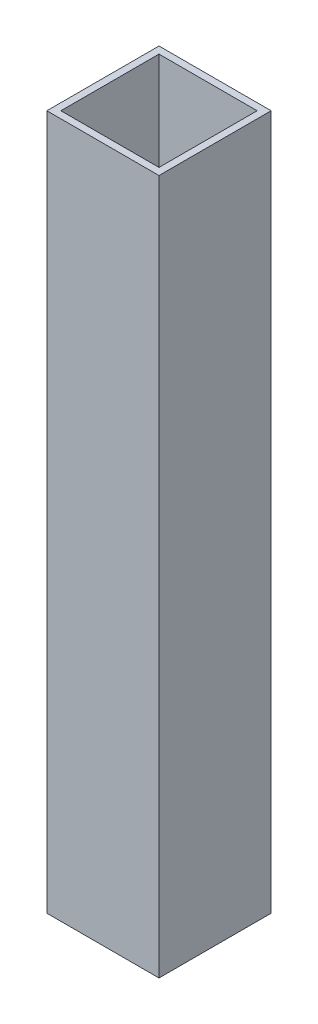
ISO-10303-21;
HEADER;
FILE_DESCRIPTION(('STEP AP214'),'2;1');
FILE_NAME('part.step','',(''),(''),'','','');
FILE_SCHEMA(('AUTOMOTIVE_DESIGN { 1 0 10303 214 1 1 1 1 }'));
ENDSEC;
DATA;
#1=APPLICATION_CONTEXT('core data for automotive mechanical design processes');
#2=APPLICATION_PROTOCOL_DEFINITION('international standard','automotive_design',2000,#1);
#3=PRODUCT_CONTEXT('',#1,'mechanical');
#4=PRODUCT('Part','Part','',(#3));
#5=PRODUCT_RELATED_PRODUCT_CATEGORY('part','',(#4));
#6=PRODUCT_DEFINITION_FORMATION('','',#4);
#7=PRODUCT_DEFINITION_CONTEXT('part definition',#1,'design');
#8=PRODUCT_DEFINITION('design','',#6,#7);
#9=PRODUCT_DEFINITION_SHAPE('','',#8);
#10=(LENGTH_UNIT() NAMED_UNIT(*) SI_UNIT(.MILLI.,.METRE.));
#11=(NAMED_UNIT(*) PLANE_ANGLE_UNIT() SI_UNIT($,.RADIAN.));
#12=(NAMED_UNIT(*) SI_UNIT($,.STERADIAN.) SOLID_ANGLE_UNIT());
#13=UNCERTAINTY_MEASURE_WITH_UNIT(LENGTH_MEASURE(1.E-05),#10,'distance_accuracy_value','');
#14=(GEOMETRIC_REPRESENTATION_CONTEXT(3) GLOBAL_UNCERTAINTY_ASSIGNED_CONTEXT((#13)) GLOBAL_UNIT_ASSIGNED_CONTEXT((#10,
#11,#12)) REPRESENTATION_CONTEXT('',''));
#15=CARTESIAN_POINT('',(0.,0.,0.));
#16=DIRECTION('',(0.,0.,1.));
#17=DIRECTION('',(1.,0.,0.));
#18=AXIS2_PLACEMENT_3D('',#15,#16,#17);
#19=CARTESIAN_POINT('',(0.,314.8076,0.));
#20=DIRECTION('',(0.,-1.,0.));
#21=DIRECTION('',(0.,0.,-1.));
#22=AXIS2_PLACEMENT_3D('',#19,#20,#21);
#23=PLANE('',#22);
#24=DIRECTION('',(0.,0.,-1.));
#25=VECTOR('',#24,1.);
#26=CARTESIAN_POINT('',(25.4,314.8076,25.4));
#27=LINE('',#26,#25);
#28=CARTESIAN_POINT('',(25.4,314.8076,25.4));
#29=VERTEX_POINT('',#28);
#30=CARTESIAN_POINT('',(25.4,314.8076,-25.4));
#31=VERTEX_POINT('',#30);
#32=EDGE_CURVE('E139',#29,#31,#27,.T.);
#33=ORIENTED_EDGE('',*,*,#32,.T.);
#34=DIRECTION('',(-1.,0.,0.));
#35=VECTOR('',#34,1.);
#36=CARTESIAN_POINT('',(-25.4,314.8076,-25.4));
#37=LINE('',#36,#35);
#38=CARTESIAN_POINT('',(-25.4,314.8076,-25.4));
#39=VERTEX_POINT('',#38);
#40=EDGE_CURVE('E142',#31,#39,#37,.T.);
#41=ORIENTED_EDGE('',*,*,#40,.T.);
#42=DIRECTION('',(0.,0.,1.));
#43=VECTOR('',#42,1.);
#44=CARTESIAN_POINT('',(-25.4,314.8076,25.4));
#45=LINE('',#44,#43);
#46=CARTESIAN_POINT('',(-25.4,314.8076,25.4));
#47=VERTEX_POINT('',#46);
#48=EDGE_CURVE('E147',#39,#47,#45,.T.);
#49=ORIENTED_EDGE('',*,*,#48,.T.);
#50=DIRECTION('',(1.,0.,0.));
#51=VECTOR('',#50,1.);
#52=CARTESIAN_POINT('',(-25.4,314.8076,25.4));
#53=LINE('',#52,#51);
#54=EDGE_CURVE('E149',#47,#29,#53,.T.);
#55=ORIENTED_EDGE('',*,*,#54,.T.);
#56=EDGE_LOOP('',(#33,#41,#49,#55));
#57=FACE_BOUND('',#56,.T.);
#58=DIRECTION('',(0.,0.,1.));
#59=VECTOR('',#58,1.);
#60=CARTESIAN_POINT('',(-22.225,314.8076,22.225));
#61=LINE('',#60,#59);
#62=CARTESIAN_POINT('',(-22.225,314.8076,-22.225));
#63=VERTEX_POINT('',#62);
#64=CARTESIAN_POINT('',(-22.225,314.8076,22.225));
#65=VERTEX_POINT('',#64);
#66=EDGE_CURVE('E101',#63,#65,#61,.T.);
#67=ORIENTED_EDGE('',*,*,#66,.F.);
#68=DIRECTION('',(-1.,0.,0.));
#69=VECTOR('',#68,1.);
#70=CARTESIAN_POINT('',(-22.225,314.8076,-22.225));
#71=LINE('',#70,#69);
#72=CARTESIAN_POINT('',(22.225,314.8076,-22.225));
#73=VERTEX_POINT('',#72);
#74=EDGE_CURVE('E128',#73,#63,#71,.T.);
#75=ORIENTED_EDGE('',*,*,#74,.F.);
#76=DIRECTION('',(0.,0.,-1.));
#77=VECTOR('',#76,1.);
#78=CARTESIAN_POINT('',(22.225,314.8076,22.225));
#79=LINE('',#78,#77);
#80=CARTESIAN_POINT('',(22.225,314.8076,22.225));
#81=VERTEX_POINT('',#80);
#82=EDGE_CURVE('E125',#81,#73,#79,.T.);
#83=ORIENTED_EDGE('',*,*,#82,.F.);
#84=DIRECTION('',(1.,0.,0.));
#85=VECTOR('',#84,1.);
#86=CARTESIAN_POINT('',(-22.225,314.8076,22.225));
#87=LINE('',#86,#85);
#88=EDGE_CURVE('E115',#65,#81,#87,.T.);
#89=ORIENTED_EDGE('',*,*,#88,.F.);
#90=EDGE_LOOP('',(#67,#75,#83,#89));
#91=FACE_BOUND('',#90,.T.);
#92=ADVANCED_FACE('F39',(#57,#91),#23,.F.);
#93=CARTESIAN_POINT('',(0.,0.,0.));
#94=DIRECTION('',(0.,-1.,0.));
#95=DIRECTION('',(0.,0.,-1.));
#96=AXIS2_PLACEMENT_3D('',#93,#94,#95);
#97=PLANE('',#96);
#98=DIRECTION('',(0.,0.,-1.));
#99=VECTOR('',#98,1.);
#100=CARTESIAN_POINT('',(25.4,0.,25.4));
#101=LINE('',#100,#99);
#102=CARTESIAN_POINT('',(25.4,0.,25.4));
#103=VERTEX_POINT('',#102);
#104=CARTESIAN_POINT('',(25.4,0.,-25.4));
#105=VERTEX_POINT('',#104);
#106=EDGE_CURVE('E120',#103,#105,#101,.T.);
#107=ORIENTED_EDGE('',*,*,#106,.F.);
#108=DIRECTION('',(1.,0.,0.));
#109=VECTOR('',#108,1.);
#110=CARTESIAN_POINT('',(-25.4,0.,25.4));
#111=LINE('',#110,#109);
#112=CARTESIAN_POINT('',(-25.4,0.,25.4));
#113=VERTEX_POINT('',#112);
#114=EDGE_CURVE('E143',#113,#103,#111,.T.);
#115=ORIENTED_EDGE('',*,*,#114,.F.);
#116=DIRECTION('',(0.,0.,1.));
#117=VECTOR('',#116,1.);
#118=CARTESIAN_POINT('',(-25.4,0.,25.4));
#119=LINE('',#118,#117);
#120=CARTESIAN_POINT('',(-25.4,0.,-25.4));
#121=VERTEX_POINT('',#120);
#122=EDGE_CURVE('E155',#121,#113,#119,.T.);
#123=ORIENTED_EDGE('',*,*,#122,.F.);
#124=DIRECTION('',(-1.,0.,0.));
#125=VECTOR('',#124,1.);
#126=CARTESIAN_POINT('',(-25.4,0.,-25.4));
#127=LINE('',#126,#125);
#128=EDGE_CURVE('E154',#105,#121,#127,.T.);
#129=ORIENTED_EDGE('',*,*,#128,.F.);
#130=EDGE_LOOP('',(#107,#115,#123,#129));
#131=FACE_BOUND('',#130,.T.);
#132=DIRECTION('',(-1.,0.,0.));
#133=VECTOR('',#132,1.);
#134=CARTESIAN_POINT('',(-22.225,0.,-22.225));
#135=LINE('',#134,#133);
#136=CARTESIAN_POINT('',(22.225,0.,-22.225));
#137=VERTEX_POINT('',#136);
#138=CARTESIAN_POINT('',(-22.225,0.,-22.225));
#139=VERTEX_POINT('',#138);
#140=EDGE_CURVE('E111',#137,#139,#135,.T.);
#141=ORIENTED_EDGE('',*,*,#140,.T.);
#142=DIRECTION('',(0.,0.,1.));
#143=VECTOR('',#142,1.);
#144=CARTESIAN_POINT('',(-22.225,0.,22.225));
#145=LINE('',#144,#143);
#146=CARTESIAN_POINT('',(-22.225,0.,22.225));
#147=VERTEX_POINT('',#146);
#148=EDGE_CURVE('E62',#139,#147,#145,.T.);
#149=ORIENTED_EDGE('',*,*,#148,.T.);
#150=DIRECTION('',(1.,0.,0.));
#151=VECTOR('',#150,1.);
#152=CARTESIAN_POINT('',(-22.225,0.,22.225));
#153=LINE('',#152,#151);
#154=CARTESIAN_POINT('',(22.225,0.,22.225));
#155=VERTEX_POINT('',#154);
#156=EDGE_CURVE('E118',#147,#155,#153,.T.);
#157=ORIENTED_EDGE('',*,*,#156,.T.);
#158=DIRECTION('',(0.,0.,-1.));
#159=VECTOR('',#158,1.);
#160=CARTESIAN_POINT('',(22.225,0.,22.225));
#161=LINE('',#160,#159);
#162=EDGE_CURVE('E135',#155,#137,#161,.T.);
#163=ORIENTED_EDGE('',*,*,#162,.T.);
#164=EDGE_LOOP('',(#141,#149,#157,#163));
#165=FACE_BOUND('',#164,.T.);
#166=ADVANCED_FACE('F171',(#131,#165),#97,.T.);
#167=CARTESIAN_POINT('',(25.4,314.8076,25.4));
#168=DIRECTION('',(-1.,0.,0.));
#169=DIRECTION('',(0.,0.,1.));
#170=AXIS2_PLACEMENT_3D('',#167,#168,#169);
#171=PLANE('',#170);
#172=ORIENTED_EDGE('',*,*,#106,.T.);
#173=DIRECTION('',(0.,-1.,0.));
#174=VECTOR('',#173,1.);
#175=CARTESIAN_POINT('',(25.4,314.8076,-25.4));
#176=LINE('',#175,#174);
#177=EDGE_CURVE('E11',#31,#105,#176,.T.);
#178=ORIENTED_EDGE('',*,*,#177,.F.);
#179=ORIENTED_EDGE('',*,*,#32,.F.);
#180=DIRECTION('',(0.,-1.,0.));
#181=VECTOR('',#180,1.);
#182=CARTESIAN_POINT('',(25.4,314.8076,25.4));
#183=LINE('',#182,#181);
#184=EDGE_CURVE('E148',#29,#103,#183,.T.);
#185=ORIENTED_EDGE('',*,*,#184,.T.);
#186=EDGE_LOOP('',(#172,#178,#179,#185));
#187=FACE_BOUND('',#186,.T.);
#188=ADVANCED_FACE('F41',(#187),#171,.F.);
#189=CARTESIAN_POINT('',(-25.4,314.8076,-25.4));
#190=DIRECTION('',(0.,0.,1.));
#191=DIRECTION('',(1.,0.,0.));
#192=AXIS2_PLACEMENT_3D('',#189,#190,#191);
#193=PLANE('',#192);
#194=ORIENTED_EDGE('',*,*,#128,.T.);
#195=DIRECTION('',(0.,-1.,0.));
#196=VECTOR('',#195,1.);
#197=CARTESIAN_POINT('',(-25.4,314.8076,-25.4));
#198=LINE('',#197,#196);
#199=EDGE_CURVE('E50',#39,#121,#198,.T.);
#200=ORIENTED_EDGE('',*,*,#199,.F.);
#201=ORIENTED_EDGE('',*,*,#40,.F.);
#202=ORIENTED_EDGE('',*,*,#177,.T.);
#203=EDGE_LOOP('',(#194,#200,#201,#202));
#204=FACE_BOUND('',#203,.T.);
#205=ADVANCED_FACE('F183',(#204),#193,.F.);
#206=CARTESIAN_POINT('',(-25.4,314.8076,25.4));
#207=DIRECTION('',(1.,0.,0.));
#208=DIRECTION('',(0.,0.,-1.));
#209=AXIS2_PLACEMENT_3D('',#206,#207,#208);
#210=PLANE('',#209);
#211=ORIENTED_EDGE('',*,*,#122,.T.);
#212=DIRECTION('',(0.,-1.,0.));
#213=VECTOR('',#212,1.);
#214=CARTESIAN_POINT('',(-25.4,314.8076,25.4));
#215=LINE('',#214,#213);
#216=EDGE_CURVE('E158',#47,#113,#215,.T.);
#217=ORIENTED_EDGE('',*,*,#216,.F.);
#218=ORIENTED_EDGE('',*,*,#48,.F.);
#219=ORIENTED_EDGE('',*,*,#199,.T.);
#220=EDGE_LOOP('',(#211,#217,#218,#219));
#221=FACE_BOUND('',#220,.T.);
#222=ADVANCED_FACE('F167',(#221),#210,.F.);
#223=CARTESIAN_POINT('',(-25.4,314.8076,25.4));
#224=DIRECTION('',(0.,0.,-1.));
#225=DIRECTION('',(-1.,0.,0.));
#226=AXIS2_PLACEMENT_3D('',#223,#224,#225);
#227=PLANE('',#226);
#228=ORIENTED_EDGE('',*,*,#114,.T.);
#229=ORIENTED_EDGE('',*,*,#184,.F.);
#230=ORIENTED_EDGE('',*,*,#54,.F.);
#231=ORIENTED_EDGE('',*,*,#216,.T.);
#232=EDGE_LOOP('',(#228,#229,#230,#231));
#233=FACE_BOUND('',#232,.T.);
#234=ADVANCED_FACE('F180',(#233),#227,.F.);
#235=CARTESIAN_POINT('',(-22.225,314.8076,22.225));
#236=DIRECTION('',(1.,0.,0.));
#237=DIRECTION('',(0.,0.,-1.));
#238=AXIS2_PLACEMENT_3D('',#235,#236,#237);
#239=PLANE('',#238);
#240=ORIENTED_EDGE('',*,*,#148,.F.);
#241=DIRECTION('',(0.,-1.,0.));
#242=VECTOR('',#241,1.);
#243=CARTESIAN_POINT('',(-22.225,314.8076,-22.225));
#244=LINE('',#243,#242);
#245=EDGE_CURVE('E109',#63,#139,#244,.T.);
#246=ORIENTED_EDGE('',*,*,#245,.F.);
#247=ORIENTED_EDGE('',*,*,#66,.T.);
#248=DIRECTION('',(0.,-1.,0.));
#249=VECTOR('',#248,1.);
#250=CARTESIAN_POINT('',(-22.225,314.8076,22.225));
#251=LINE('',#250,#249);
#252=EDGE_CURVE('E107',#65,#147,#251,.T.);
#253=ORIENTED_EDGE('',*,*,#252,.T.);
#254=EDGE_LOOP('',(#240,#246,#247,#253));
#255=FACE_BOUND('',#254,.T.);
#256=ADVANCED_FACE('F106',(#255),#239,.T.);
#257=CARTESIAN_POINT('',(-22.225,314.8076,22.225));
#258=DIRECTION('',(0.,0.,-1.));
#259=DIRECTION('',(-1.,0.,0.));
#260=AXIS2_PLACEMENT_3D('',#257,#258,#259);
#261=PLANE('',#260);
#262=ORIENTED_EDGE('',*,*,#156,.F.);
#263=ORIENTED_EDGE('',*,*,#252,.F.);
#264=ORIENTED_EDGE('',*,*,#88,.T.);
#265=DIRECTION('',(0.,-1.,0.));
#266=VECTOR('',#265,1.);
#267=CARTESIAN_POINT('',(22.225,314.8076,22.225));
#268=LINE('',#267,#266);
#269=EDGE_CURVE('E123',#81,#155,#268,.T.);
#270=ORIENTED_EDGE('',*,*,#269,.T.);
#271=EDGE_LOOP('',(#262,#263,#264,#270));
#272=FACE_BOUND('',#271,.T.);
#273=ADVANCED_FACE('F116',(#272),#261,.T.);
#274=CARTESIAN_POINT('',(22.225,314.8076,22.225));
#275=DIRECTION('',(-1.,0.,0.));
#276=DIRECTION('',(0.,0.,1.));
#277=AXIS2_PLACEMENT_3D('',#274,#275,#276);
#278=PLANE('',#277);
#279=ORIENTED_EDGE('',*,*,#162,.F.);
#280=ORIENTED_EDGE('',*,*,#269,.F.);
#281=ORIENTED_EDGE('',*,*,#82,.T.);
#282=DIRECTION('',(0.,-1.,0.));
#283=VECTOR('',#282,1.);
#284=CARTESIAN_POINT('',(22.225,314.8076,-22.225));
#285=LINE('',#284,#283);
#286=EDGE_CURVE('E53',#73,#137,#285,.T.);
#287=ORIENTED_EDGE('',*,*,#286,.T.);
#288=EDGE_LOOP('',(#279,#280,#281,#287));
#289=FACE_BOUND('',#288,.T.);
#290=ADVANCED_FACE('F206',(#289),#278,.T.);
#291=CARTESIAN_POINT('',(-22.225,314.8076,-22.225));
#292=DIRECTION('',(0.,0.,1.));
#293=DIRECTION('',(1.,0.,0.));
#294=AXIS2_PLACEMENT_3D('',#291,#292,#293);
#295=PLANE('',#294);
#296=ORIENTED_EDGE('',*,*,#140,.F.);
#297=ORIENTED_EDGE('',*,*,#286,.F.);
#298=ORIENTED_EDGE('',*,*,#74,.T.);
#299=ORIENTED_EDGE('',*,*,#245,.T.);
#300=EDGE_LOOP('',(#296,#297,#298,#299));
#301=FACE_BOUND('',#300,.T.);
#302=ADVANCED_FACE('F210',(#301),#295,.T.);
#303=CLOSED_SHELL('',(#92,#166,#188,#205,#222,#234,#256,#273,#290,#302));
#304=MANIFOLD_SOLID_BREP('B2',#303);
#305=ADVANCED_BREP_SHAPE_REPRESENTATION('',(#18,#304),#14);
#306=SHAPE_DEFINITION_REPRESENTATION(#9,#305);
ENDSEC;
END-ISO-10303-21;
